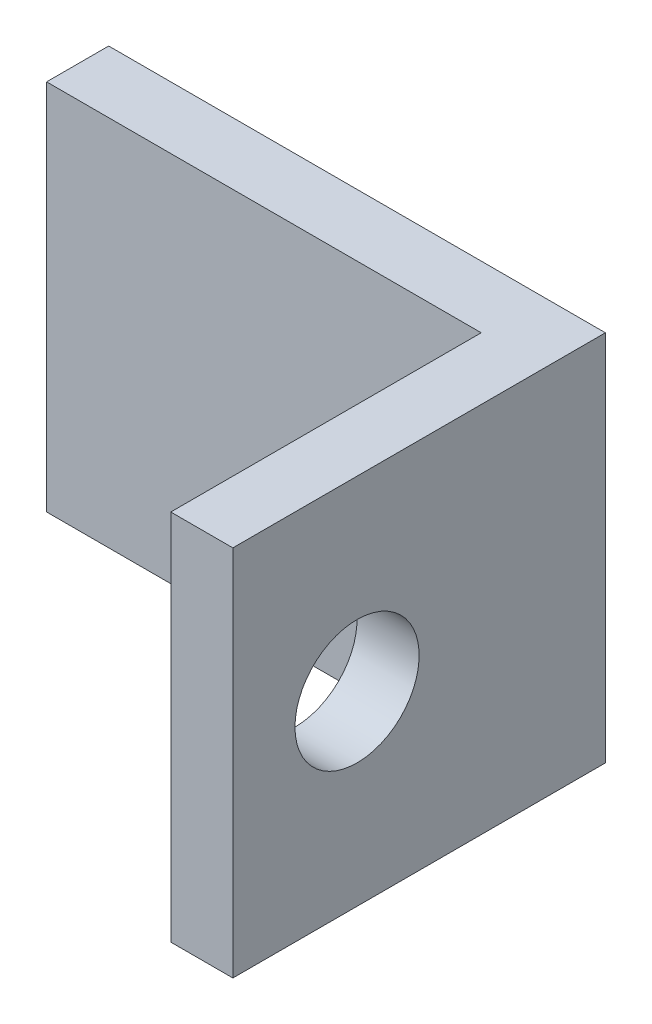
ISO-10303-21;
HEADER;
FILE_DESCRIPTION(('STEP AP214'),'2;1');
FILE_NAME('part.step','',(''),(''),'','','');
FILE_SCHEMA(('AUTOMOTIVE_DESIGN { 1 0 10303 214 1 1 1 1 }'));
ENDSEC;
DATA;
#1=APPLICATION_CONTEXT('core data for automotive mechanical design processes');
#2=APPLICATION_PROTOCOL_DEFINITION('international standard','automotive_design',2000,#1);
#3=PRODUCT_CONTEXT('',#1,'mechanical');
#4=PRODUCT('Part','Part','',(#3));
#5=PRODUCT_RELATED_PRODUCT_CATEGORY('part','',(#4));
#6=PRODUCT_DEFINITION_FORMATION('','',#4);
#7=PRODUCT_DEFINITION_CONTEXT('part definition',#1,'design');
#8=PRODUCT_DEFINITION('design','',#6,#7);
#9=PRODUCT_DEFINITION_SHAPE('','',#8);
#10=(LENGTH_UNIT() NAMED_UNIT(*) SI_UNIT(.MILLI.,.METRE.));
#11=(NAMED_UNIT(*) PLANE_ANGLE_UNIT() SI_UNIT($,.RADIAN.));
#12=(NAMED_UNIT(*) SI_UNIT($,.STERADIAN.) SOLID_ANGLE_UNIT());
#13=UNCERTAINTY_MEASURE_WITH_UNIT(LENGTH_MEASURE(1.E-05),#10,'distance_accuracy_value','');
#14=(GEOMETRIC_REPRESENTATION_CONTEXT(3) GLOBAL_UNCERTAINTY_ASSIGNED_CONTEXT((#13)) GLOBAL_UNIT_ASSIGNED_CONTEXT((#10,
#11,#12)) REPRESENTATION_CONTEXT('',''));
#15=CARTESIAN_POINT('',(0.,0.,0.));
#16=DIRECTION('',(0.,0.,1.));
#17=DIRECTION('',(1.,0.,0.));
#18=AXIS2_PLACEMENT_3D('',#15,#16,#17);
#19=CARTESIAN_POINT('',(0.,9.525,1.5875));
#20=DIRECTION('',(1.,0.,0.));
#21=DIRECTION('',(0.,0.,-1.));
#22=AXIS2_PLACEMENT_3D('',#19,#20,#21);
#23=PLANE('',#22);
#24=DIRECTION('',(0.,0.,1.));
#25=VECTOR('',#24,1.);
#26=CARTESIAN_POINT('',(0.,0.,1.5875));
#27=LINE('',#26,#25);
#28=CARTESIAN_POINT('',(0.,0.,0.));
#29=VERTEX_POINT('',#28);
#30=CARTESIAN_POINT('',(0.,0.,1.5875));
#31=VERTEX_POINT('',#30);
#32=EDGE_CURVE('E140',#29,#31,#27,.T.);
#33=ORIENTED_EDGE('',*,*,#32,.T.);
#34=DIRECTION('',(0.,-1.,0.));
#35=VECTOR('',#34,1.);
#36=CARTESIAN_POINT('',(0.,9.525,1.5875));
#37=LINE('',#36,#35);
#38=CARTESIAN_POINT('',(0.,9.525,1.5875));
#39=VERTEX_POINT('',#38);
#40=EDGE_CURVE('E11',#39,#31,#37,.T.);
#41=ORIENTED_EDGE('',*,*,#40,.F.);
#42=DIRECTION('',(0.,0.,1.));
#43=VECTOR('',#42,1.);
#44=CARTESIAN_POINT('',(0.,9.525,1.5875));
#45=LINE('',#44,#43);
#46=CARTESIAN_POINT('',(0.,9.525,0.));
#47=VERTEX_POINT('',#46);
#48=EDGE_CURVE('E157',#47,#39,#45,.T.);
#49=ORIENTED_EDGE('',*,*,#48,.F.);
#50=DIRECTION('',(0.,-1.,0.));
#51=VECTOR('',#50,1.);
#52=CARTESIAN_POINT('',(0.,9.525,0.));
#53=LINE('',#52,#51);
#54=EDGE_CURVE('E136',#47,#29,#53,.T.);
#55=ORIENTED_EDGE('',*,*,#54,.T.);
#56=EDGE_LOOP('',(#33,#41,#49,#55));
#57=FACE_BOUND('',#56,.T.);
#58=ADVANCED_FACE('F38',(#57),#23,.F.);
#59=CARTESIAN_POINT('',(11.1125,9.525,1.5875));
#60=DIRECTION('',(0.,0.,-1.));
#61=DIRECTION('',(-1.,0.,0.));
#62=AXIS2_PLACEMENT_3D('',#59,#60,#61);
#63=PLANE('',#62);
#64=DIRECTION('',(1.,0.,0.));
#65=VECTOR('',#64,1.);
#66=CARTESIAN_POINT('',(11.1125,0.,1.5875));
#67=LINE('',#66,#65);
#68=CARTESIAN_POINT('',(11.1125,0.,1.5875));
#69=VERTEX_POINT('',#68);
#70=EDGE_CURVE('E144',#31,#69,#67,.T.);
#71=ORIENTED_EDGE('',*,*,#70,.T.);
#72=DIRECTION('',(0.,-1.,0.));
#73=VECTOR('',#72,1.);
#74=CARTESIAN_POINT('',(11.1125,9.525,1.5875));
#75=LINE('',#74,#73);
#76=CARTESIAN_POINT('',(11.1125,9.525,1.5875));
#77=VERTEX_POINT('',#76);
#78=EDGE_CURVE('E47',#77,#69,#75,.T.);
#79=ORIENTED_EDGE('',*,*,#78,.F.);
#80=DIRECTION('',(1.,0.,0.));
#81=VECTOR('',#80,1.);
#82=CARTESIAN_POINT('',(11.1125,9.525,1.5875));
#83=LINE('',#82,#81);
#84=EDGE_CURVE('E103',#39,#77,#83,.T.);
#85=ORIENTED_EDGE('',*,*,#84,.F.);
#86=ORIENTED_EDGE('',*,*,#40,.T.);
#87=EDGE_LOOP('',(#71,#79,#85,#86));
#88=FACE_BOUND('',#87,.T.);
#89=ADVANCED_FACE('F186',(#88),#63,.F.);
#90=CARTESIAN_POINT('',(11.1125,9.525,9.525));
#91=DIRECTION('',(1.,0.,0.));
#92=DIRECTION('',(0.,0.,-1.));
#93=AXIS2_PLACEMENT_3D('',#90,#91,#92);
#94=PLANE('',#93);
#95=CARTESIAN_POINT('',(11.1125,4.7625,6.35));
#96=DIRECTION('',(-1.,0.,0.));
#97=DIRECTION('',(0.,0.,1.));
#98=AXIS2_PLACEMENT_3D('',#95,#96,#97);
#99=CIRCLE('',#98,1.5875);
#100=CARTESIAN_POINT('',(11.1125,4.7625,7.9375));
#101=VERTEX_POINT('',#100);
#102=EDGE_CURVE('E262',#101,#101,#99,.T.);
#103=ORIENTED_EDGE('',*,*,#102,.F.);
#104=EDGE_LOOP('',(#103));
#105=FACE_BOUND('',#104,.T.);
#106=DIRECTION('',(0.,0.,1.));
#107=VECTOR('',#106,1.);
#108=CARTESIAN_POINT('',(11.1125,0.,9.525));
#109=LINE('',#108,#107);
#110=CARTESIAN_POINT('',(11.1125,0.,9.525));
#111=VERTEX_POINT('',#110);
#112=EDGE_CURVE('E148',#69,#111,#109,.T.);
#113=ORIENTED_EDGE('',*,*,#112,.T.);
#114=DIRECTION('',(0.,-1.,0.));
#115=VECTOR('',#114,1.);
#116=CARTESIAN_POINT('',(11.1125,9.525,9.525));
#117=LINE('',#116,#115);
#118=CARTESIAN_POINT('',(11.1125,9.525,9.525));
#119=VERTEX_POINT('',#118);
#120=EDGE_CURVE('E128',#119,#111,#117,.T.);
#121=ORIENTED_EDGE('',*,*,#120,.F.);
#122=DIRECTION('',(0.,0.,1.));
#123=VECTOR('',#122,1.);
#124=CARTESIAN_POINT('',(11.1125,9.525,9.525));
#125=LINE('',#124,#123);
#126=EDGE_CURVE('E117',#77,#119,#125,.T.);
#127=ORIENTED_EDGE('',*,*,#126,.F.);
#128=ORIENTED_EDGE('',*,*,#78,.T.);
#129=EDGE_LOOP('',(#113,#121,#127,#128));
#130=FACE_BOUND('',#129,.T.);
#131=ADVANCED_FACE('F167',(#105,#130),#94,.F.);
#132=CARTESIAN_POINT('',(12.7,9.525,9.525));
#133=DIRECTION('',(0.,0.,-1.));
#134=DIRECTION('',(-1.,0.,0.));
#135=AXIS2_PLACEMENT_3D('',#132,#133,#134);
#136=PLANE('',#135);
#137=DIRECTION('',(1.,0.,0.));
#138=VECTOR('',#137,1.);
#139=CARTESIAN_POINT('',(12.7,0.,9.525));
#140=LINE('',#139,#138);
#141=CARTESIAN_POINT('',(12.7,0.,9.525));
#142=VERTEX_POINT('',#141);
#143=EDGE_CURVE('E126',#111,#142,#140,.T.);
#144=ORIENTED_EDGE('',*,*,#143,.T.);
#145=DIRECTION('',(0.,-1.,0.));
#146=VECTOR('',#145,1.);
#147=CARTESIAN_POINT('',(12.7,9.525,9.525));
#148=LINE('',#147,#146);
#149=CARTESIAN_POINT('',(12.7,9.525,9.525));
#150=VERTEX_POINT('',#149);
#151=EDGE_CURVE('E123',#150,#142,#148,.T.);
#152=ORIENTED_EDGE('',*,*,#151,.F.);
#153=DIRECTION('',(1.,0.,0.));
#154=VECTOR('',#153,1.);
#155=CARTESIAN_POINT('',(12.7,9.525,9.525));
#156=LINE('',#155,#154);
#157=EDGE_CURVE('E111',#119,#150,#156,.T.);
#158=ORIENTED_EDGE('',*,*,#157,.F.);
#159=ORIENTED_EDGE('',*,*,#120,.T.);
#160=EDGE_LOOP('',(#144,#152,#158,#159));
#161=FACE_BOUND('',#160,.T.);
#162=ADVANCED_FACE('F124',(#161),#136,.F.);
#163=CARTESIAN_POINT('',(12.7,9.525,0.));
#164=DIRECTION('',(-1.,0.,0.));
#165=DIRECTION('',(0.,0.,1.));
#166=AXIS2_PLACEMENT_3D('',#163,#164,#165);
#167=PLANE('',#166);
#168=CARTESIAN_POINT('',(12.7,4.7625,6.35));
#169=DIRECTION('',(-1.,0.,0.));
#170=DIRECTION('',(0.,0.,1.));
#171=AXIS2_PLACEMENT_3D('',#168,#169,#170);
#172=CIRCLE('',#171,1.5875);
#173=CARTESIAN_POINT('',(12.7,4.7625,7.9375));
#174=VERTEX_POINT('',#173);
#175=EDGE_CURVE('E145',#174,#174,#172,.T.);
#176=ORIENTED_EDGE('',*,*,#175,.T.);
#177=EDGE_LOOP('',(#176));
#178=FACE_BOUND('',#177,.T.);
#179=DIRECTION('',(0.,0.,-1.));
#180=VECTOR('',#179,1.);
#181=CARTESIAN_POINT('',(12.7,0.,0.));
#182=LINE('',#181,#180);
#183=CARTESIAN_POINT('',(12.7,0.,0.));
#184=VERTEX_POINT('',#183);
#185=EDGE_CURVE('E87',#142,#184,#182,.T.);
#186=ORIENTED_EDGE('',*,*,#185,.T.);
#187=DIRECTION('',(0.,-1.,0.));
#188=VECTOR('',#187,1.);
#189=CARTESIAN_POINT('',(12.7,9.525,0.));
#190=LINE('',#189,#188);
#191=CARTESIAN_POINT('',(12.7,9.525,0.));
#192=VERTEX_POINT('',#191);
#193=EDGE_CURVE('E129',#192,#184,#190,.T.);
#194=ORIENTED_EDGE('',*,*,#193,.F.);
#195=DIRECTION('',(0.,0.,-1.));
#196=VECTOR('',#195,1.);
#197=CARTESIAN_POINT('',(12.7,9.525,0.));
#198=LINE('',#197,#196);
#199=EDGE_CURVE('E115',#150,#192,#198,.T.);
#200=ORIENTED_EDGE('',*,*,#199,.F.);
#201=ORIENTED_EDGE('',*,*,#151,.T.);
#202=EDGE_LOOP('',(#186,#194,#200,#201));
#203=FACE_BOUND('',#202,.T.);
#204=ADVANCED_FACE('F131',(#178,#203),#167,.F.);
#205=CARTESIAN_POINT('',(0.,9.525,0.));
#206=DIRECTION('',(0.,0.,1.));
#207=DIRECTION('',(1.,0.,0.));
#208=AXIS2_PLACEMENT_3D('',#205,#206,#207);
#209=PLANE('',#208);
#210=DIRECTION('',(-1.,0.,0.));
#211=VECTOR('',#210,1.);
#212=CARTESIAN_POINT('',(0.,0.,0.));
#213=LINE('',#212,#211);
#214=EDGE_CURVE('E95',#184,#29,#213,.T.);
#215=ORIENTED_EDGE('',*,*,#214,.T.);
#216=ORIENTED_EDGE('',*,*,#54,.F.);
#217=DIRECTION('',(-1.,0.,0.));
#218=VECTOR('',#217,1.);
#219=CARTESIAN_POINT('',(0.,9.525,0.));
#220=LINE('',#219,#218);
#221=EDGE_CURVE('E57',#192,#47,#220,.T.);
#222=ORIENTED_EDGE('',*,*,#221,.F.);
#223=ORIENTED_EDGE('',*,*,#193,.T.);
#224=EDGE_LOOP('',(#215,#216,#222,#223));
#225=FACE_BOUND('',#224,.T.);
#226=ADVANCED_FACE('F174',(#225),#209,.F.);
#227=CARTESIAN_POINT('',(0.,9.525,0.));
#228=DIRECTION('',(0.,-1.,0.));
#229=DIRECTION('',(0.,0.,-1.));
#230=AXIS2_PLACEMENT_3D('',#227,#228,#229);
#231=PLANE('',#230);
#232=ORIENTED_EDGE('',*,*,#48,.T.);
#233=ORIENTED_EDGE('',*,*,#84,.T.);
#234=ORIENTED_EDGE('',*,*,#126,.T.);
#235=ORIENTED_EDGE('',*,*,#157,.T.);
#236=ORIENTED_EDGE('',*,*,#199,.T.);
#237=ORIENTED_EDGE('',*,*,#221,.T.);
#238=EDGE_LOOP('',(#232,#233,#234,#235,#236,#237));
#239=FACE_BOUND('',#238,.T.);
#240=ADVANCED_FACE('F113',(#239),#231,.F.);
#241=CARTESIAN_POINT('',(0.,0.,0.));
#242=DIRECTION('',(0.,-1.,0.));
#243=DIRECTION('',(0.,0.,-1.));
#244=AXIS2_PLACEMENT_3D('',#241,#242,#243);
#245=PLANE('',#244);
#246=ORIENTED_EDGE('',*,*,#32,.F.);
#247=ORIENTED_EDGE('',*,*,#214,.F.);
#248=ORIENTED_EDGE('',*,*,#185,.F.);
#249=ORIENTED_EDGE('',*,*,#143,.F.);
#250=ORIENTED_EDGE('',*,*,#112,.F.);
#251=ORIENTED_EDGE('',*,*,#70,.F.);
#252=EDGE_LOOP('',(#246,#247,#248,#249,#250,#251));
#253=FACE_BOUND('',#252,.T.);
#254=ADVANCED_FACE('F170',(#253),#245,.T.);
#255=CARTESIAN_POINT('',(11.1125,4.7625,6.35));
#256=DIRECTION('',(-1.,0.,0.));
#257=DIRECTION('',(0.,0.,1.));
#258=AXIS2_PLACEMENT_3D('',#255,#256,#257);
#259=CYLINDRICAL_SURFACE('',#258,1.5875);
#260=ORIENTED_EDGE('',*,*,#175,.F.);
#261=EDGE_LOOP('',(#260));
#262=FACE_BOUND('',#261,.T.);
#263=ORIENTED_EDGE('',*,*,#102,.T.);
#264=EDGE_LOOP('',(#263));
#265=FACE_BOUND('',#264,.T.);
#266=ADVANCED_FACE('F245',(#262,#265),#259,.F.);
#267=CLOSED_SHELL('',(#58,#89,#131,#162,#204,#226,#240,#254,#266));
#268=MANIFOLD_SOLID_BREP('B2',#267);
#269=ADVANCED_BREP_SHAPE_REPRESENTATION('',(#18,#268),#14);
#270=SHAPE_DEFINITION_REPRESENTATION(#9,#269);
ENDSEC;
END-ISO-10303-21;
